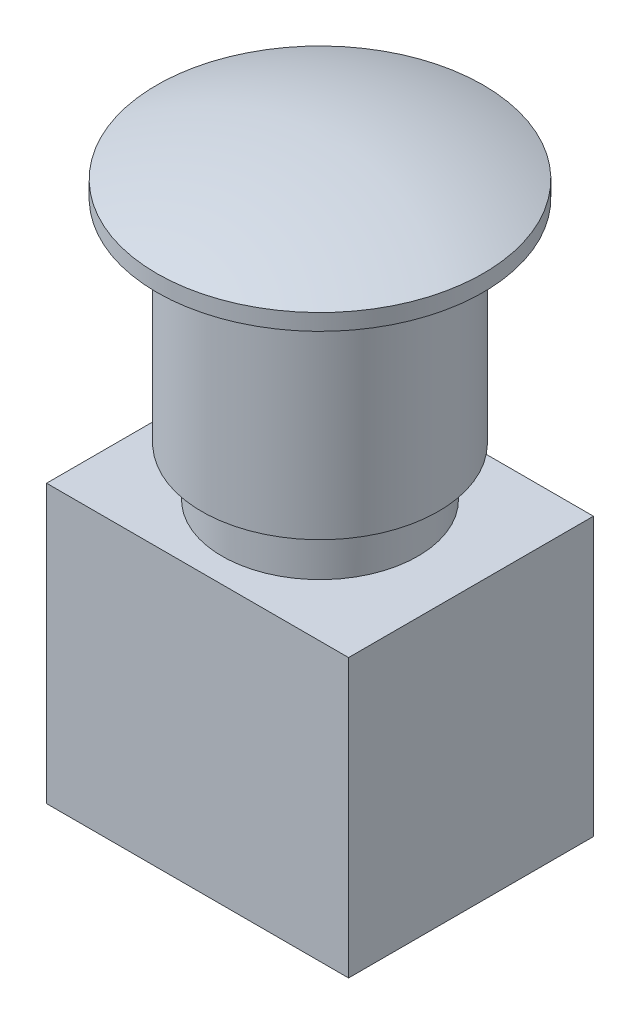
ISO-10303-21;
HEADER;
FILE_DESCRIPTION(('STEP AP214'),'2;1');
FILE_NAME('part.step','',(''),(''),'','','');
FILE_SCHEMA(('AUTOMOTIVE_DESIGN { 1 0 10303 214 1 1 1 1 }'));
ENDSEC;
DATA;
#1=APPLICATION_CONTEXT('core data for automotive mechanical design processes');
#2=APPLICATION_PROTOCOL_DEFINITION('international standard','automotive_design',2000,#1);
#3=PRODUCT_CONTEXT('',#1,'mechanical');
#4=PRODUCT('Part','Part','',(#3));
#5=PRODUCT_RELATED_PRODUCT_CATEGORY('part','',(#4));
#6=PRODUCT_DEFINITION_FORMATION('','',#4);
#7=PRODUCT_DEFINITION_CONTEXT('part definition',#1,'design');
#8=PRODUCT_DEFINITION('design','',#6,#7);
#9=PRODUCT_DEFINITION_SHAPE('','',#8);
#10=(LENGTH_UNIT() NAMED_UNIT(*) SI_UNIT(.MILLI.,.METRE.));
#11=(NAMED_UNIT(*) PLANE_ANGLE_UNIT() SI_UNIT($,.RADIAN.));
#12=(NAMED_UNIT(*) SI_UNIT($,.STERADIAN.) SOLID_ANGLE_UNIT());
#13=UNCERTAINTY_MEASURE_WITH_UNIT(LENGTH_MEASURE(1.E-05),#10,'distance_accuracy_value','');
#14=(GEOMETRIC_REPRESENTATION_CONTEXT(3) GLOBAL_UNCERTAINTY_ASSIGNED_CONTEXT((#13)) GLOBAL_UNIT_ASSIGNED_CONTEXT((#10,
#11,#12)) REPRESENTATION_CONTEXT('',''));
#15=CARTESIAN_POINT('',(0.,0.,0.));
#16=DIRECTION('',(0.,0.,1.));
#17=DIRECTION('',(1.,0.,0.));
#18=AXIS2_PLACEMENT_3D('',#15,#16,#17);
#19=CARTESIAN_POINT('',(0.,34.,0.));
#20=DIRECTION('',(0.,-1.,0.));
#21=DIRECTION('',(0.,0.,-1.));
#22=AXIS2_PLACEMENT_3D('',#19,#20,#21);
#23=PLANE('',#22);
#24=DIRECTION('',(0.,0.,-1.));
#25=VECTOR('',#24,1.);
#26=CARTESIAN_POINT('',(18.5,34.,15.));
#27=LINE('',#26,#25);
#28=CARTESIAN_POINT('',(18.5,34.,15.));
#29=VERTEX_POINT('',#28);
#30=CARTESIAN_POINT('',(18.5,34.,-15.));
#31=VERTEX_POINT('',#30);
#32=EDGE_CURVE('E91',#29,#31,#27,.T.);
#33=ORIENTED_EDGE('',*,*,#32,.T.);
#34=DIRECTION('',(-1.,0.,0.));
#35=VECTOR('',#34,1.);
#36=CARTESIAN_POINT('',(-18.5,34.,-15.));
#37=LINE('',#36,#35);
#38=CARTESIAN_POINT('',(-18.5,34.,-15.));
#39=VERTEX_POINT('',#38);
#40=EDGE_CURVE('E86',#31,#39,#37,.T.);
#41=ORIENTED_EDGE('',*,*,#40,.T.);
#42=DIRECTION('',(0.,0.,1.));
#43=VECTOR('',#42,1.);
#44=CARTESIAN_POINT('',(-18.5,34.,15.));
#45=LINE('',#44,#43);
#46=CARTESIAN_POINT('',(-18.5,34.,15.));
#47=VERTEX_POINT('',#46);
#48=EDGE_CURVE('E89',#39,#47,#45,.T.);
#49=ORIENTED_EDGE('',*,*,#48,.T.);
#50=DIRECTION('',(1.,0.,0.));
#51=VECTOR('',#50,1.);
#52=CARTESIAN_POINT('',(-18.5,34.,15.));
#53=LINE('',#52,#51);
#54=EDGE_CURVE('E55',#47,#29,#53,.T.);
#55=ORIENTED_EDGE('',*,*,#54,.T.);
#56=EDGE_LOOP('',(#33,#41,#49,#55));
#57=FACE_BOUND('',#56,.T.);
#58=CARTESIAN_POINT('',(0.,34.,0.));
#59=DIRECTION('',(0.,-1.,0.));
#60=DIRECTION('',(0.,0.,-1.));
#61=AXIS2_PLACEMENT_3D('',#58,#59,#60);
#62=CIRCLE('',#61,12.);
#63=CARTESIAN_POINT('',(0.,34.,-12.));
#64=VERTEX_POINT('',#63);
#65=EDGE_CURVE('E11',#64,#64,#62,.F.);
#66=ORIENTED_EDGE('',*,*,#65,.F.);
#67=EDGE_LOOP('',(#66));
#68=FACE_BOUND('',#67,.T.);
#69=ADVANCED_FACE('F37',(#57,#68),#23,.F.);
#70=CARTESIAN_POINT('',(18.5,34.,15.));
#71=DIRECTION('',(-1.,0.,0.));
#72=DIRECTION('',(0.,0.,1.));
#73=AXIS2_PLACEMENT_3D('',#70,#71,#72);
#74=PLANE('',#73);
#75=DIRECTION('',(0.,0.,-1.));
#76=VECTOR('',#75,1.);
#77=CARTESIAN_POINT('',(18.5,0.,15.));
#78=LINE('',#77,#76);
#79=CARTESIAN_POINT('',(18.5,0.,15.));
#80=VERTEX_POINT('',#79);
#81=CARTESIAN_POINT('',(18.5,0.,-15.));
#82=VERTEX_POINT('',#81);
#83=EDGE_CURVE('E105',#80,#82,#78,.T.);
#84=ORIENTED_EDGE('',*,*,#83,.T.);
#85=DIRECTION('',(0.,-1.,0.));
#86=VECTOR('',#85,1.);
#87=CARTESIAN_POINT('',(18.5,34.,-15.));
#88=LINE('',#87,#86);
#89=EDGE_CURVE('E47',#31,#82,#88,.T.);
#90=ORIENTED_EDGE('',*,*,#89,.F.);
#91=ORIENTED_EDGE('',*,*,#32,.F.);
#92=DIRECTION('',(0.,-1.,0.));
#93=VECTOR('',#92,1.);
#94=CARTESIAN_POINT('',(18.5,34.,15.));
#95=LINE('',#94,#93);
#96=EDGE_CURVE('E101',#29,#80,#95,.T.);
#97=ORIENTED_EDGE('',*,*,#96,.T.);
#98=EDGE_LOOP('',(#84,#90,#91,#97));
#99=FACE_BOUND('',#98,.T.);
#100=ADVANCED_FACE('F116',(#99),#74,.F.);
#101=CARTESIAN_POINT('',(-18.5,34.,-15.));
#102=DIRECTION('',(0.,0.,1.));
#103=DIRECTION('',(1.,0.,0.));
#104=AXIS2_PLACEMENT_3D('',#101,#102,#103);
#105=PLANE('',#104);
#106=DIRECTION('',(-1.,0.,0.));
#107=VECTOR('',#106,1.);
#108=CARTESIAN_POINT('',(-18.5,0.,-15.));
#109=LINE('',#108,#107);
#110=CARTESIAN_POINT('',(-18.5,0.,-15.));
#111=VERTEX_POINT('',#110);
#112=EDGE_CURVE('E96',#82,#111,#109,.T.);
#113=ORIENTED_EDGE('',*,*,#112,.T.);
#114=DIRECTION('',(0.,-1.,0.));
#115=VECTOR('',#114,1.);
#116=CARTESIAN_POINT('',(-18.5,34.,-15.));
#117=LINE('',#116,#115);
#118=EDGE_CURVE('E94',#39,#111,#117,.T.);
#119=ORIENTED_EDGE('',*,*,#118,.F.);
#120=ORIENTED_EDGE('',*,*,#40,.F.);
#121=ORIENTED_EDGE('',*,*,#89,.T.);
#122=EDGE_LOOP('',(#113,#119,#120,#121));
#123=FACE_BOUND('',#122,.T.);
#124=ADVANCED_FACE('F95',(#123),#105,.F.);
#125=CARTESIAN_POINT('',(-18.5,34.,15.));
#126=DIRECTION('',(1.,0.,0.));
#127=DIRECTION('',(0.,0.,-1.));
#128=AXIS2_PLACEMENT_3D('',#125,#126,#127);
#129=PLANE('',#128);
#130=DIRECTION('',(0.,0.,1.));
#131=VECTOR('',#130,1.);
#132=CARTESIAN_POINT('',(-18.5,0.,15.));
#133=LINE('',#132,#131);
#134=CARTESIAN_POINT('',(-18.5,0.,15.));
#135=VERTEX_POINT('',#134);
#136=EDGE_CURVE('E72',#111,#135,#133,.T.);
#137=ORIENTED_EDGE('',*,*,#136,.T.);
#138=DIRECTION('',(0.,-1.,0.));
#139=VECTOR('',#138,1.);
#140=CARTESIAN_POINT('',(-18.5,34.,15.));
#141=LINE('',#140,#139);
#142=EDGE_CURVE('E97',#47,#135,#141,.T.);
#143=ORIENTED_EDGE('',*,*,#142,.F.);
#144=ORIENTED_EDGE('',*,*,#48,.F.);
#145=ORIENTED_EDGE('',*,*,#118,.T.);
#146=EDGE_LOOP('',(#137,#143,#144,#145));
#147=FACE_BOUND('',#146,.T.);
#148=ADVANCED_FACE('F99',(#147),#129,.F.);
#149=CARTESIAN_POINT('',(-18.5,34.,15.));
#150=DIRECTION('',(0.,0.,-1.));
#151=DIRECTION('',(-1.,0.,0.));
#152=AXIS2_PLACEMENT_3D('',#149,#150,#151);
#153=PLANE('',#152);
#154=DIRECTION('',(1.,0.,0.));
#155=VECTOR('',#154,1.);
#156=CARTESIAN_POINT('',(-18.5,0.,15.));
#157=LINE('',#156,#155);
#158=EDGE_CURVE('E78',#135,#80,#157,.T.);
#159=ORIENTED_EDGE('',*,*,#158,.T.);
#160=ORIENTED_EDGE('',*,*,#96,.F.);
#161=ORIENTED_EDGE('',*,*,#54,.F.);
#162=ORIENTED_EDGE('',*,*,#142,.T.);
#163=EDGE_LOOP('',(#159,#160,#161,#162));
#164=FACE_BOUND('',#163,.T.);
#165=ADVANCED_FACE('F121',(#164),#153,.F.);
#166=CARTESIAN_POINT('',(0.,0.,0.));
#167=DIRECTION('',(0.,-1.,0.));
#168=DIRECTION('',(0.,0.,-1.));
#169=AXIS2_PLACEMENT_3D('',#166,#167,#168);
#170=PLANE('',#169);
#171=ORIENTED_EDGE('',*,*,#83,.F.);
#172=ORIENTED_EDGE('',*,*,#158,.F.);
#173=ORIENTED_EDGE('',*,*,#136,.F.);
#174=ORIENTED_EDGE('',*,*,#112,.F.);
#175=EDGE_LOOP('',(#171,#172,#173,#174));
#176=FACE_BOUND('',#175,.T.);
#177=ADVANCED_FACE('F118',(#176),#170,.T.);
#178=CARTESIAN_POINT('',(0.,40.,0.));
#179=DIRECTION('',(0.,-1.,0.));
#180=DIRECTION('',(0.,0.,-1.));
#181=AXIS2_PLACEMENT_3D('',#178,#179,#180);
#182=CYLINDRICAL_SURFACE('',#181,12.);
#183=CARTESIAN_POINT('',(0.,40.,0.));
#184=DIRECTION('',(0.,1.,0.));
#185=DIRECTION('',(0.,0.,1.));
#186=AXIS2_PLACEMENT_3D('',#183,#184,#185);
#187=CIRCLE('',#186,12.);
#188=CARTESIAN_POINT('',(0.,40.,12.));
#189=VERTEX_POINT('',#188);
#190=EDGE_CURVE('E108',#189,#189,#187,.T.);
#191=ORIENTED_EDGE('',*,*,#190,.F.);
#192=EDGE_LOOP('',(#191));
#193=FACE_BOUND('',#192,.T.);
#194=ORIENTED_EDGE('',*,*,#65,.T.);
#195=EDGE_LOOP('',(#194));
#196=FACE_BOUND('',#195,.T.);
#197=ADVANCED_FACE('F120',(#193,#196),#182,.T.);
#198=CARTESIAN_POINT('',(0.,40.,0.));
#199=DIRECTION('',(0.,1.,0.));
#200=DIRECTION('',(0.,0.,1.));
#201=AXIS2_PLACEMENT_3D('',#198,#199,#200);
#202=PLANE('',#201);
#203=CARTESIAN_POINT('',(0.,40.,0.));
#204=DIRECTION('',(0.,1.,0.));
#205=DIRECTION('',(0.,0.,1.));
#206=AXIS2_PLACEMENT_3D('',#203,#204,#205);
#207=CIRCLE('',#206,14.5);
#208=CARTESIAN_POINT('',(0.,40.,-14.5));
#209=VERTEX_POINT('',#208);
#210=EDGE_CURVE('E161',#209,#209,#207,.T.);
#211=ORIENTED_EDGE('',*,*,#210,.F.);
#212=EDGE_LOOP('',(#211));
#213=FACE_BOUND('',#212,.T.);
#214=ORIENTED_EDGE('',*,*,#190,.T.);
#215=EDGE_LOOP('',(#214));
#216=FACE_BOUND('',#215,.T.);
#217=ADVANCED_FACE('F127',(#213,#216),#202,.F.);
#218=CARTESIAN_POINT('',(0.,66.,0.));
#219=DIRECTION('',(0.,-1.,0.));
#220=DIRECTION('',(0.,0.,-1.));
#221=AXIS2_PLACEMENT_3D('',#218,#219,#220);
#222=CYLINDRICAL_SURFACE('',#221,14.5);
#223=CARTESIAN_POINT('',(0.,66.,0.));
#224=DIRECTION('',(0.,1.,0.));
#225=DIRECTION('',(0.,0.,1.));
#226=AXIS2_PLACEMENT_3D('',#223,#224,#225);
#227=CIRCLE('',#226,14.5);
#228=CARTESIAN_POINT('',(0.,66.,-14.5));
#229=VERTEX_POINT('',#228);
#230=EDGE_CURVE('E159',#229,#229,#227,.T.);
#231=CARTESIAN_POINT('',(0.,66.,-14.5));
#232=CARTESIAN_POINT('',(0.,65.7291666666667,-14.5));
#233=CARTESIAN_POINT('',(0.,65.4583333333333,-14.5));
#234=CARTESIAN_POINT('',(0.,64.9166666666667,-14.5));
#235=CARTESIAN_POINT('',(0.,64.6458333333333,-14.5));
#236=CARTESIAN_POINT('',(0.,64.1041666666667,-14.5));
#237=CARTESIAN_POINT('',(0.,63.8333333333333,-14.5));
#238=CARTESIAN_POINT('',(0.,63.2916666666667,-14.5));
#239=CARTESIAN_POINT('',(0.,63.0208333333333,-14.5));
#240=CARTESIAN_POINT('',(0.,62.4791666666667,-14.5));
#241=CARTESIAN_POINT('',(0.,62.2083333333333,-14.5));
#242=CARTESIAN_POINT('',(0.,61.6666666666667,-14.5));
#243=CARTESIAN_POINT('',(0.,61.3958333333333,-14.5));
#244=CARTESIAN_POINT('',(0.,60.8541666666667,-14.5));
#245=CARTESIAN_POINT('',(0.,60.5833333333333,-14.5));
#246=CARTESIAN_POINT('',(0.,60.0416666666667,-14.5));
#247=CARTESIAN_POINT('',(0.,59.7708333333333,-14.5));
#248=CARTESIAN_POINT('',(0.,59.2291666666667,-14.5));
#249=CARTESIAN_POINT('',(0.,58.9583333333333,-14.5));
#250=CARTESIAN_POINT('',(0.,58.4166666666667,-14.5));
#251=CARTESIAN_POINT('',(0.,58.1458333333333,-14.5));
#252=CARTESIAN_POINT('',(0.,57.6041666666667,-14.5));
#253=CARTESIAN_POINT('',(0.,57.3333333333333,-14.5));
#254=CARTESIAN_POINT('',(0.,56.7916666666667,-14.5));
#255=CARTESIAN_POINT('',(0.,56.5208333333333,-14.5));
#256=CARTESIAN_POINT('',(0.,55.9791666666667,-14.5));
#257=CARTESIAN_POINT('',(0.,55.7083333333333,-14.5));
#258=CARTESIAN_POINT('',(0.,55.1666666666667,-14.5));
#259=CARTESIAN_POINT('',(0.,54.8958333333333,-14.5));
#260=CARTESIAN_POINT('',(0.,54.3541666666667,-14.5));
#261=CARTESIAN_POINT('',(0.,54.0833333333333,-14.5));
#262=CARTESIAN_POINT('',(0.,53.5416666666667,-14.5));
#263=CARTESIAN_POINT('',(0.,53.2708333333333,-14.5));
#264=CARTESIAN_POINT('',(0.,52.7291666666667,-14.5));
#265=CARTESIAN_POINT('',(0.,52.4583333333333,-14.5));
#266=CARTESIAN_POINT('',(0.,51.9166666666667,-14.5));
#267=CARTESIAN_POINT('',(0.,51.6458333333333,-14.5));
#268=CARTESIAN_POINT('',(0.,51.1041666666667,-14.5));
#269=CARTESIAN_POINT('',(0.,50.8333333333333,-14.5));
#270=CARTESIAN_POINT('',(0.,50.2916666666667,-14.5));
#271=CARTESIAN_POINT('',(0.,50.0208333333333,-14.5));
#272=CARTESIAN_POINT('',(0.,49.4791666666667,-14.5));
#273=CARTESIAN_POINT('',(0.,49.2083333333333,-14.5));
#274=CARTESIAN_POINT('',(0.,48.6666666666667,-14.5));
#275=CARTESIAN_POINT('',(0.,48.3958333333333,-14.5));
#276=CARTESIAN_POINT('',(0.,47.8541666666667,-14.5));
#277=CARTESIAN_POINT('',(0.,47.5833333333333,-14.5));
#278=CARTESIAN_POINT('',(0.,47.0416666666667,-14.5));
#279=CARTESIAN_POINT('',(0.,46.7708333333333,-14.5));
#280=CARTESIAN_POINT('',(0.,46.2291666666667,-14.5));
#281=CARTESIAN_POINT('',(0.,45.9583333333333,-14.5));
#282=CARTESIAN_POINT('',(0.,45.4166666666667,-14.5));
#283=CARTESIAN_POINT('',(0.,45.1458333333333,-14.5));
#284=CARTESIAN_POINT('',(0.,44.6041666666667,-14.5));
#285=CARTESIAN_POINT('',(0.,44.3333333333333,-14.5));
#286=CARTESIAN_POINT('',(0.,43.7916666666667,-14.5));
#287=CARTESIAN_POINT('',(0.,43.5208333333333,-14.5));
#288=CARTESIAN_POINT('',(0.,42.9791666666667,-14.5));
#289=CARTESIAN_POINT('',(0.,42.7083333333333,-14.5));
#290=CARTESIAN_POINT('',(0.,42.1666666666667,-14.5));
#291=CARTESIAN_POINT('',(0.,41.8958333333333,-14.5));
#292=CARTESIAN_POINT('',(0.,41.3541666666667,-14.5));
#293=CARTESIAN_POINT('',(0.,41.0833333333333,-14.5));
#294=CARTESIAN_POINT('',(0.,40.5416666666667,-14.5));
#295=CARTESIAN_POINT('',(0.,40.2708333333333,-14.5));
#296=CARTESIAN_POINT('',(0.,40.,-14.5));
#297=B_SPLINE_CURVE_WITH_KNOTS('',3,(#231,#232,#233,#234,#235,#236,#237,#238,#239,#240,#241,
#242,#243,#244,#245,#246,#247,#248,#249,#250,#251,#252,#253,#254,#255,#256,#257,#258,#259,#260,
#261,#262,#263,#264,#265,#266,#267,#268,#269,#270,#271,#272,#273,#274,#275,#276,#277,#278,#279,
#280,#281,#282,#283,#284,#285,#286,#287,#288,#289,#290,#291,#292,#293,#294,#295,#296),
.UNSPECIFIED.,.F.,.F.,(4,2,2,2,2,2,2,2,2,2,2,2,2,2,2,2,2,2,2,2,2,2,2,2,2,2,2,2,2,2,2,2,4),(0.,
0.812499999999994,1.62499999999999,2.4375,3.24999999999999,4.06249999999999,4.87499999999999,
5.68749999999999,6.49999999999999,7.31249999999999,8.12499999999999,8.93749999999999,
9.74999999999999,10.5625,11.375,12.1875,13.,13.8125,14.625,15.4375,16.25,17.0625,17.875,18.6875,
19.5,20.3125,21.125,21.9375,22.75,23.5625,24.375,25.1875,26.),.UNSPECIFIED.);
#298=EDGE_CURVE('BSEAM137',#229,#209,#297,.T.);
#299=ORIENTED_EDGE('',*,*,#230,.F.);
#300=ORIENTED_EDGE('',*,*,#210,.T.);
#301=ORIENTED_EDGE('',*,*,#298,.T.);
#302=ORIENTED_EDGE('',*,*,#298,.F.);
#303=EDGE_LOOP('',(#299,#301,#300,#302));
#304=FACE_BOUND('',#303,.T.);
#305=ADVANCED_FACE('F137',(#304),#222,.T.);
#306=CARTESIAN_POINT('',(0.,66.,0.));
#307=DIRECTION('',(0.,1.,0.));
#308=DIRECTION('',(0.,0.,1.));
#309=AXIS2_PLACEMENT_3D('',#306,#307,#308);
#310=PLANE('',#309);
#311=CARTESIAN_POINT('',(0.,66.,0.));
#312=DIRECTION('',(0.,1.,0.));
#313=DIRECTION('',(0.,0.,1.));
#314=AXIS2_PLACEMENT_3D('',#311,#312,#313);
#315=CIRCLE('',#314,20.);
#316=CARTESIAN_POINT('',(0.,66.,20.));
#317=VERTEX_POINT('',#316);
#318=EDGE_CURVE('E156',#317,#317,#315,.T.);
#319=ORIENTED_EDGE('',*,*,#318,.F.);
#320=EDGE_LOOP('',(#319));
#321=FACE_BOUND('',#320,.T.);
#322=ORIENTED_EDGE('',*,*,#230,.T.);
#323=EDGE_LOOP('',(#322));
#324=FACE_BOUND('',#323,.T.);
#325=ADVANCED_FACE('F140',(#321,#324),#310,.F.);
#326=CARTESIAN_POINT('',(0.,68.,0.));
#327=DIRECTION('',(0.,-1.,0.));
#328=DIRECTION('',(0.,0.,-1.));
#329=AXIS2_PLACEMENT_3D('',#326,#327,#328);
#330=CYLINDRICAL_SURFACE('',#329,20.);
#331=CARTESIAN_POINT('',(0.,68.,0.));
#332=DIRECTION('',(0.,1.,0.));
#333=DIRECTION('',(0.,0.,1.));
#334=AXIS2_PLACEMENT_3D('',#331,#332,#333);
#335=CIRCLE('',#334,20.);
#336=CARTESIAN_POINT('',(0.,68.,20.));
#337=VERTEX_POINT('',#336);
#338=EDGE_CURVE('E41',#337,#337,#335,.T.);
#339=ORIENTED_EDGE('',*,*,#338,.F.);
#340=EDGE_LOOP('',(#339));
#341=FACE_BOUND('',#340,.T.);
#342=ORIENTED_EDGE('',*,*,#318,.T.);
#343=EDGE_LOOP('',(#342));
#344=FACE_BOUND('',#343,.T.);
#345=ADVANCED_FACE('F145',(#341,#344),#330,.T.);
#346=CARTESIAN_POINT('',(0.,20.0000000000001,0.));
#347=DIRECTION('',(0.,0.,1.));
#348=DIRECTION('',(1.,0.,0.));
#349=AXIS2_PLACEMENT_3D('',#346,#347,#348);
#350=SPHERICAL_SURFACE('',#349,52.);
#351=CARTESIAN_POINT('',(0.,20.0000000000001,0.));
#352=DIRECTION('',(0.,1.,0.));
#353=DIRECTION('',(0.,0.,1.));
#354=AXIS2_PLACEMENT_3D('',#351,#352,#353);
#355=SPHERICAL_SURFACE('',#354,52.);
#356=ORIENTED_EDGE('',*,*,#338,.T.);
#357=EDGE_LOOP('',(#356));
#358=FACE_BOUND('',#357,.T.);
#359=ADVANCED_FACE('F39',(#358),#355,.T.);
#360=CLOSED_SHELL('',(#69,#100,#124,#148,#165,#177,#197,#217,#305,#325,#345,#359));
#361=MANIFOLD_SOLID_BREP('B2',#360);
#362=ADVANCED_BREP_SHAPE_REPRESENTATION('',(#18,#361),#14);
#363=SHAPE_DEFINITION_REPRESENTATION(#9,#362);
ENDSEC;
END-ISO-10303-21;
